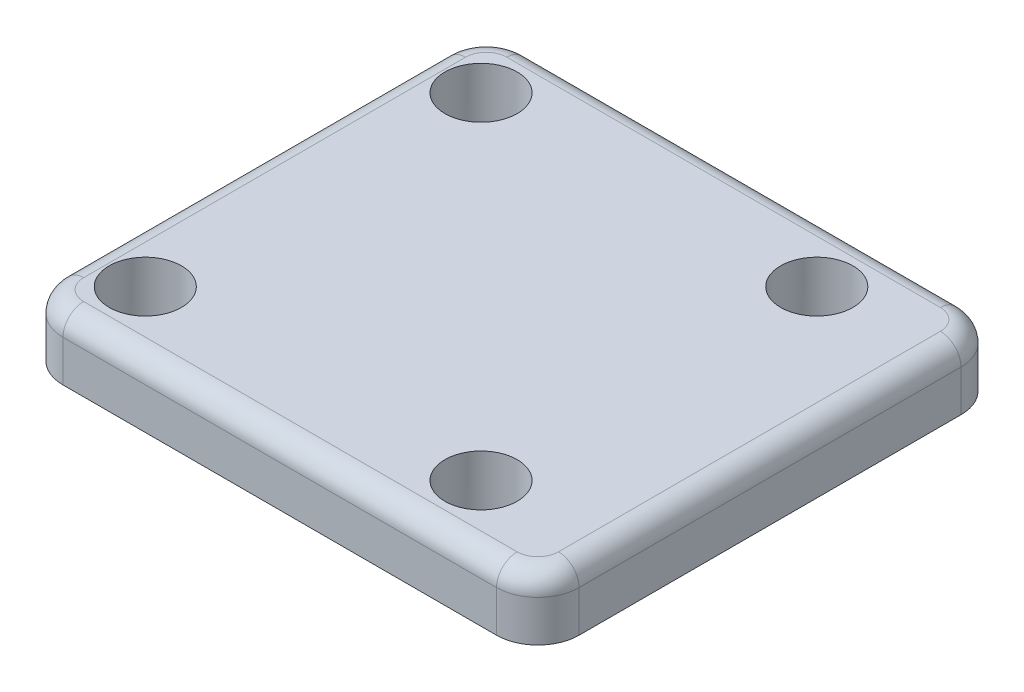
ISO-10303-21;
HEADER;
FILE_DESCRIPTION(('STEP AP214'),'2;1');
FILE_NAME('part.step','',(''),(''),'','','');
FILE_SCHEMA(('AUTOMOTIVE_DESIGN { 1 0 10303 214 1 1 1 1 }'));
ENDSEC;
DATA;
#1=APPLICATION_CONTEXT('core data for automotive mechanical design processes');
#2=APPLICATION_PROTOCOL_DEFINITION('international standard','automotive_design',2000,#1);
#3=PRODUCT_CONTEXT('',#1,'mechanical');
#4=PRODUCT('Part','Part','',(#3));
#5=PRODUCT_RELATED_PRODUCT_CATEGORY('part','',(#4));
#6=PRODUCT_DEFINITION_FORMATION('','',#4);
#7=PRODUCT_DEFINITION_CONTEXT('part definition',#1,'design');
#8=PRODUCT_DEFINITION('design','',#6,#7);
#9=PRODUCT_DEFINITION_SHAPE('','',#8);
#10=(LENGTH_UNIT() NAMED_UNIT(*) SI_UNIT(.MILLI.,.METRE.));
#11=(NAMED_UNIT(*) PLANE_ANGLE_UNIT() SI_UNIT($,.RADIAN.));
#12=(NAMED_UNIT(*) SI_UNIT($,.STERADIAN.) SOLID_ANGLE_UNIT());
#13=UNCERTAINTY_MEASURE_WITH_UNIT(LENGTH_MEASURE(1.E-05),#10,'distance_accuracy_value','');
#14=(GEOMETRIC_REPRESENTATION_CONTEXT(3) GLOBAL_UNCERTAINTY_ASSIGNED_CONTEXT((#13)) GLOBAL_UNIT_ASSIGNED_CONTEXT((#10,
#11,#12)) REPRESENTATION_CONTEXT('',''));
#15=CARTESIAN_POINT('',(0.,0.,0.));
#16=DIRECTION('',(0.,0.,1.));
#17=DIRECTION('',(1.,0.,0.));
#18=AXIS2_PLACEMENT_3D('',#15,#16,#17);
#19=CARTESIAN_POINT('',(24.,6.,-18.5));
#20=DIRECTION('',(0.,-1.,0.));
#21=DIRECTION('',(0.,0.,-1.));
#22=AXIS2_PLACEMENT_3D('',#19,#20,#21);
#23=CYLINDRICAL_SURFACE('',#22,4.);
#24=DIRECTION('',(0.,-1.,0.));
#25=VECTOR('',#24,1.);
#26=CARTESIAN_POINT('',(24.,6.,-22.5));
#27=LINE('',#26,#25);
#28=CARTESIAN_POINT('',(24.,4.,-22.5));
#29=VERTEX_POINT('',#28);
#30=CARTESIAN_POINT('',(24.,0.,-22.5));
#31=VERTEX_POINT('',#30);
#32=EDGE_CURVE('E132',#29,#31,#27,.T.);
#33=ORIENTED_EDGE('',*,*,#32,.F.);
#34=CARTESIAN_POINT('',(24.,4.,-18.5));
#35=DIRECTION('',(0.,-1.,0.));
#36=DIRECTION('',(0.,0.,-1.));
#37=AXIS2_PLACEMENT_3D('',#34,#35,#36);
#38=CIRCLE('',#37,4.);
#39=CARTESIAN_POINT('',(28.,4.,-18.5));
#40=VERTEX_POINT('',#39);
#41=EDGE_CURVE('E214',#29,#40,#38,.T.);
#42=ORIENTED_EDGE('',*,*,#41,.T.);
#43=DIRECTION('',(0.,-1.,0.));
#44=VECTOR('',#43,1.);
#45=CARTESIAN_POINT('',(28.,6.,-18.5));
#46=LINE('',#45,#44);
#47=CARTESIAN_POINT('',(28.,0.,-18.5));
#48=VERTEX_POINT('',#47);
#49=EDGE_CURVE('E156',#40,#48,#46,.T.);
#50=ORIENTED_EDGE('',*,*,#49,.T.);
#51=CARTESIAN_POINT('',(24.,0.,-18.5));
#52=DIRECTION('',(0.,1.,0.));
#53=DIRECTION('',(0.,0.,-1.));
#54=AXIS2_PLACEMENT_3D('',#51,#52,#53);
#55=CIRCLE('',#54,4.);
#56=EDGE_CURVE('E150',#48,#31,#55,.T.);
#57=ORIENTED_EDGE('',*,*,#56,.T.);
#58=EDGE_LOOP('',(#33,#42,#50,#57));
#59=FACE_BOUND('',#58,.T.);
#60=ADVANCED_FACE('F39',(#59),#23,.T.);
#61=CARTESIAN_POINT('',(-18.,6.,-22.5));
#62=DIRECTION('',(0.,0.,1.));
#63=DIRECTION('',(1.,0.,0.));
#64=AXIS2_PLACEMENT_3D('',#61,#62,#63);
#65=PLANE('',#64);
#66=DIRECTION('',(0.,-1.,0.));
#67=VECTOR('',#66,1.);
#68=CARTESIAN_POINT('',(-18.,6.,-22.5));
#69=LINE('',#68,#67);
#70=CARTESIAN_POINT('',(-18.,4.,-22.5));
#71=VERTEX_POINT('',#70);
#72=CARTESIAN_POINT('',(-18.,0.,-22.5));
#73=VERTEX_POINT('',#72);
#74=EDGE_CURVE('E144',#71,#73,#69,.T.);
#75=ORIENTED_EDGE('',*,*,#74,.F.);
#76=DIRECTION('',(-1.,0.,0.));
#77=VECTOR('',#76,1.);
#78=CARTESIAN_POINT('',(-18.,4.,-22.5));
#79=LINE('',#78,#77);
#80=EDGE_CURVE('E139',#71,#29,#79,.F.);
#81=ORIENTED_EDGE('',*,*,#80,.T.);
#82=ORIENTED_EDGE('',*,*,#32,.T.);
#83=DIRECTION('',(-1.,0.,0.));
#84=VECTOR('',#83,1.);
#85=CARTESIAN_POINT('',(-18.,0.,-22.5));
#86=LINE('',#85,#84);
#87=EDGE_CURVE('E136',#31,#73,#86,.T.);
#88=ORIENTED_EDGE('',*,*,#87,.T.);
#89=EDGE_LOOP('',(#75,#81,#82,#88));
#90=FACE_BOUND('',#89,.T.);
#91=ADVANCED_FACE('F135',(#90),#65,.F.);
#92=CARTESIAN_POINT('',(-18.,6.,-18.5));
#93=DIRECTION('',(0.,-1.,0.));
#94=DIRECTION('',(0.,0.,-1.));
#95=AXIS2_PLACEMENT_3D('',#92,#93,#94);
#96=CYLINDRICAL_SURFACE('',#95,4.);
#97=DIRECTION('',(0.,-1.,0.));
#98=VECTOR('',#97,1.);
#99=CARTESIAN_POINT('',(-22.,6.,-18.5));
#100=LINE('',#99,#98);
#101=CARTESIAN_POINT('',(-22.,4.,-18.5));
#102=VERTEX_POINT('',#101);
#103=CARTESIAN_POINT('',(-22.,0.,-18.5));
#104=VERTEX_POINT('',#103);
#105=EDGE_CURVE('E191',#102,#104,#100,.T.);
#106=ORIENTED_EDGE('',*,*,#105,.F.);
#107=CARTESIAN_POINT('',(-18.,4.,-18.5));
#108=DIRECTION('',(0.,-1.,0.));
#109=DIRECTION('',(0.,0.,-1.));
#110=AXIS2_PLACEMENT_3D('',#107,#108,#109);
#111=CIRCLE('',#110,4.);
#112=EDGE_CURVE('E210',#102,#71,#111,.T.);
#113=ORIENTED_EDGE('',*,*,#112,.T.);
#114=ORIENTED_EDGE('',*,*,#74,.T.);
#115=CARTESIAN_POINT('',(-18.,0.,-18.5));
#116=DIRECTION('',(0.,1.,0.));
#117=DIRECTION('',(0.,0.,-1.));
#118=AXIS2_PLACEMENT_3D('',#115,#116,#117);
#119=CIRCLE('',#118,4.);
#120=EDGE_CURVE('E153',#73,#104,#119,.T.);
#121=ORIENTED_EDGE('',*,*,#120,.T.);
#122=EDGE_LOOP('',(#106,#113,#114,#121));
#123=FACE_BOUND('',#122,.T.);
#124=ADVANCED_FACE('F294',(#123),#96,.T.);
#125=CARTESIAN_POINT('',(-22.,6.,-18.5));
#126=DIRECTION('',(1.,0.,0.));
#127=DIRECTION('',(0.,0.,-1.));
#128=AXIS2_PLACEMENT_3D('',#125,#126,#127);
#129=PLANE('',#128);
#130=DIRECTION('',(0.,-1.,0.));
#131=VECTOR('',#130,1.);
#132=CARTESIAN_POINT('',(-22.,6.,18.5));
#133=LINE('',#132,#131);
#134=CARTESIAN_POINT('',(-22.,4.,18.5));
#135=VERTEX_POINT('',#134);
#136=CARTESIAN_POINT('',(-22.,0.,18.5));
#137=VERTEX_POINT('',#136);
#138=EDGE_CURVE('E189',#135,#137,#133,.T.);
#139=ORIENTED_EDGE('',*,*,#138,.F.);
#140=DIRECTION('',(0.,0.,1.));
#141=VECTOR('',#140,1.);
#142=CARTESIAN_POINT('',(-22.,4.,-18.5));
#143=LINE('',#142,#141);
#144=EDGE_CURVE('E222',#135,#102,#143,.F.);
#145=ORIENTED_EDGE('',*,*,#144,.T.);
#146=ORIENTED_EDGE('',*,*,#105,.T.);
#147=DIRECTION('',(0.,0.,1.));
#148=VECTOR('',#147,1.);
#149=CARTESIAN_POINT('',(-22.,0.,-18.5));
#150=LINE('',#149,#148);
#151=EDGE_CURVE('E168',#104,#137,#150,.T.);
#152=ORIENTED_EDGE('',*,*,#151,.T.);
#153=EDGE_LOOP('',(#139,#145,#146,#152));
#154=FACE_BOUND('',#153,.T.);
#155=ADVANCED_FACE('F337',(#154),#129,.F.);
#156=CARTESIAN_POINT('',(-18.,6.,18.5));
#157=DIRECTION('',(0.,-1.,0.));
#158=DIRECTION('',(0.,0.,-1.));
#159=AXIS2_PLACEMENT_3D('',#156,#157,#158);
#160=CYLINDRICAL_SURFACE('',#159,4.);
#161=DIRECTION('',(0.,-1.,0.));
#162=VECTOR('',#161,1.);
#163=CARTESIAN_POINT('',(-18.,6.,22.5));
#164=LINE('',#163,#162);
#165=CARTESIAN_POINT('',(-18.,4.,22.5));
#166=VERTEX_POINT('',#165);
#167=CARTESIAN_POINT('',(-18.,0.,22.5));
#168=VERTEX_POINT('',#167);
#169=EDGE_CURVE('E187',#166,#168,#164,.T.);
#170=ORIENTED_EDGE('',*,*,#169,.F.);
#171=CARTESIAN_POINT('',(-18.,4.,18.5));
#172=DIRECTION('',(0.,-1.,0.));
#173=DIRECTION('',(0.,0.,-1.));
#174=AXIS2_PLACEMENT_3D('',#171,#172,#173);
#175=CIRCLE('',#174,4.);
#176=EDGE_CURVE('E57',#166,#135,#175,.T.);
#177=ORIENTED_EDGE('',*,*,#176,.T.);
#178=ORIENTED_EDGE('',*,*,#138,.T.);
#179=CARTESIAN_POINT('',(-18.,0.,18.5));
#180=DIRECTION('',(0.,1.,0.));
#181=DIRECTION('',(0.,0.,1.));
#182=AXIS2_PLACEMENT_3D('',#179,#180,#181);
#183=CIRCLE('',#182,4.);
#184=EDGE_CURVE('E171',#137,#168,#183,.T.);
#185=ORIENTED_EDGE('',*,*,#184,.T.);
#186=EDGE_LOOP('',(#170,#177,#178,#185));
#187=FACE_BOUND('',#186,.T.);
#188=ADVANCED_FACE('F368',(#187),#160,.T.);
#189=CARTESIAN_POINT('',(-18.,6.,22.5));
#190=DIRECTION('',(0.,0.,-1.));
#191=DIRECTION('',(-1.,0.,0.));
#192=AXIS2_PLACEMENT_3D('',#189,#190,#191);
#193=PLANE('',#192);
#194=DIRECTION('',(0.,-1.,0.));
#195=VECTOR('',#194,1.);
#196=CARTESIAN_POINT('',(24.,6.,22.5));
#197=LINE('',#196,#195);
#198=CARTESIAN_POINT('',(24.,4.,22.5));
#199=VERTEX_POINT('',#198);
#200=CARTESIAN_POINT('',(24.,0.,22.5));
#201=VERTEX_POINT('',#200);
#202=EDGE_CURVE('E185',#199,#201,#197,.T.);
#203=ORIENTED_EDGE('',*,*,#202,.F.);
#204=DIRECTION('',(1.,0.,0.));
#205=VECTOR('',#204,1.);
#206=CARTESIAN_POINT('',(-18.,4.,22.5));
#207=LINE('',#206,#205);
#208=EDGE_CURVE('E65',#199,#166,#207,.F.);
#209=ORIENTED_EDGE('',*,*,#208,.T.);
#210=ORIENTED_EDGE('',*,*,#169,.T.);
#211=DIRECTION('',(1.,0.,0.));
#212=VECTOR('',#211,1.);
#213=CARTESIAN_POINT('',(-18.,0.,22.5));
#214=LINE('',#213,#212);
#215=EDGE_CURVE('E174',#168,#201,#214,.T.);
#216=ORIENTED_EDGE('',*,*,#215,.T.);
#217=EDGE_LOOP('',(#203,#209,#210,#216));
#218=FACE_BOUND('',#217,.T.);
#219=ADVANCED_FACE('F364',(#218),#193,.F.);
#220=CARTESIAN_POINT('',(24.,6.,18.5));
#221=DIRECTION('',(0.,-1.,0.));
#222=DIRECTION('',(0.,0.,-1.));
#223=AXIS2_PLACEMENT_3D('',#220,#221,#222);
#224=CYLINDRICAL_SURFACE('',#223,4.);
#225=DIRECTION('',(0.,-1.,0.));
#226=VECTOR('',#225,1.);
#227=CARTESIAN_POINT('',(28.,6.,18.5));
#228=LINE('',#227,#226);
#229=CARTESIAN_POINT('',(28.,4.,18.5));
#230=VERTEX_POINT('',#229);
#231=CARTESIAN_POINT('',(28.,0.,18.5));
#232=VERTEX_POINT('',#231);
#233=EDGE_CURVE('E183',#230,#232,#228,.T.);
#234=ORIENTED_EDGE('',*,*,#233,.F.);
#235=CARTESIAN_POINT('',(24.,4.,18.5));
#236=DIRECTION('',(0.,-1.,0.));
#237=DIRECTION('',(0.,0.,-1.));
#238=AXIS2_PLACEMENT_3D('',#235,#236,#237);
#239=CIRCLE('',#238,4.);
#240=EDGE_CURVE('E218',#230,#199,#239,.T.);
#241=ORIENTED_EDGE('',*,*,#240,.T.);
#242=ORIENTED_EDGE('',*,*,#202,.T.);
#243=CARTESIAN_POINT('',(24.,0.,18.5));
#244=DIRECTION('',(0.,1.,0.));
#245=DIRECTION('',(0.,0.,1.));
#246=AXIS2_PLACEMENT_3D('',#243,#244,#245);
#247=CIRCLE('',#246,4.);
#248=EDGE_CURVE('E177',#201,#232,#247,.T.);
#249=ORIENTED_EDGE('',*,*,#248,.T.);
#250=EDGE_LOOP('',(#234,#241,#242,#249));
#251=FACE_BOUND('',#250,.T.);
#252=ADVANCED_FACE('F357',(#251),#224,.T.);
#253=CARTESIAN_POINT('',(28.,6.,-18.5));
#254=DIRECTION('',(-1.,0.,0.));
#255=DIRECTION('',(0.,0.,1.));
#256=AXIS2_PLACEMENT_3D('',#253,#254,#255);
#257=PLANE('',#256);
#258=ORIENTED_EDGE('',*,*,#49,.F.);
#259=DIRECTION('',(0.,0.,-1.));
#260=VECTOR('',#259,1.);
#261=CARTESIAN_POINT('',(28.,4.,-18.5));
#262=LINE('',#261,#260);
#263=EDGE_CURVE('E216',#40,#230,#262,.F.);
#264=ORIENTED_EDGE('',*,*,#263,.T.);
#265=ORIENTED_EDGE('',*,*,#233,.T.);
#266=DIRECTION('',(0.,0.,-1.));
#267=VECTOR('',#266,1.);
#268=CARTESIAN_POINT('',(28.,0.,-18.5));
#269=LINE('',#268,#267);
#270=EDGE_CURVE('E180',#232,#48,#269,.T.);
#271=ORIENTED_EDGE('',*,*,#270,.T.);
#272=EDGE_LOOP('',(#258,#264,#265,#271));
#273=FACE_BOUND('',#272,.T.);
#274=ADVANCED_FACE('F348',(#273),#257,.F.);
#275=CARTESIAN_POINT('',(24.,6.,-18.5));
#276=DIRECTION('',(0.,-1.,0.));
#277=DIRECTION('',(0.,0.,-1.));
#278=AXIS2_PLACEMENT_3D('',#275,#276,#277);
#279=PLANE('',#278);
#280=CARTESIAN_POINT('',(-16.2634559672897,6.,16.2634559672906));
#281=DIRECTION('',(0.,1.,0.));
#282=DIRECTION('',(0.,0.,1.));
#283=AXIS2_PLACEMENT_3D('',#280,#281,#282);
#284=CIRCLE('',#283,3.50000000000048);
#285=CARTESIAN_POINT('',(-16.2634559672897,6.,19.7634559672911));
#286=VERTEX_POINT('',#285);
#287=EDGE_CURVE('E585',#286,#286,#284,.T.);
#288=ORIENTED_EDGE('',*,*,#287,.F.);
#289=EDGE_LOOP('',(#288));
#290=FACE_BOUND('',#289,.T.);
#291=CARTESIAN_POINT('',(16.2634559672915,6.,16.2634559672897));
#292=DIRECTION('',(0.,1.,0.));
#293=DIRECTION('',(0.,0.,1.));
#294=AXIS2_PLACEMENT_3D('',#291,#292,#293);
#295=CIRCLE('',#294,3.50000000000127);
#296=CARTESIAN_POINT('',(16.2634559672915,6.,19.763455967291));
#297=VERTEX_POINT('',#296);
#298=EDGE_CURVE('E583',#297,#297,#295,.T.);
#299=ORIENTED_EDGE('',*,*,#298,.F.);
#300=EDGE_LOOP('',(#299));
#301=FACE_BOUND('',#300,.T.);
#302=CARTESIAN_POINT('',(16.2634559672906,6.,-16.2634559672915));
#303=DIRECTION('',(0.,1.,0.));
#304=DIRECTION('',(0.,0.,1.));
#305=AXIS2_PLACEMENT_3D('',#302,#303,#304);
#306=CIRCLE('',#305,3.50000000000094);
#307=CARTESIAN_POINT('',(16.2634559672906,6.,-12.7634559672905));
#308=VERTEX_POINT('',#307);
#309=EDGE_CURVE('E584',#308,#308,#306,.T.);
#310=ORIENTED_EDGE('',*,*,#309,.F.);
#311=EDGE_LOOP('',(#310));
#312=FACE_BOUND('',#311,.T.);
#313=CARTESIAN_POINT('',(-16.2634559672906,6.,-16.2634559672906));
#314=DIRECTION('',(0.,1.,0.));
#315=DIRECTION('',(0.,0.,1.));
#316=AXIS2_PLACEMENT_3D('',#313,#314,#315);
#317=CIRCLE('',#316,3.5);
#318=CARTESIAN_POINT('',(-16.2634559672906,6.,-12.7634559672906));
#319=VERTEX_POINT('',#318);
#320=EDGE_CURVE('E248',#319,#319,#317,.T.);
#321=ORIENTED_EDGE('',*,*,#320,.F.);
#322=EDGE_LOOP('',(#321));
#323=FACE_BOUND('',#322,.T.);
#324=DIRECTION('',(-1.,0.,0.));
#325=VECTOR('',#324,1.);
#326=CARTESIAN_POINT('',(24.,6.,-20.5));
#327=LINE('',#326,#325);
#328=CARTESIAN_POINT('',(24.,6.,-20.5));
#329=VERTEX_POINT('',#328);
#330=CARTESIAN_POINT('',(-18.,6.,-20.5));
#331=VERTEX_POINT('',#330);
#332=EDGE_CURVE('E205',#329,#331,#327,.T.);
#333=ORIENTED_EDGE('',*,*,#332,.T.);
#334=CARTESIAN_POINT('',(-18.,6.,-18.5));
#335=DIRECTION('',(0.,-1.,0.));
#336=DIRECTION('',(0.,0.,-1.));
#337=AXIS2_PLACEMENT_3D('',#334,#335,#336);
#338=CIRCLE('',#337,2.);
#339=CARTESIAN_POINT('',(-20.,6.,-18.5));
#340=VERTEX_POINT('',#339);
#341=EDGE_CURVE('E207',#331,#340,#338,.F.);
#342=ORIENTED_EDGE('',*,*,#341,.T.);
#343=DIRECTION('',(0.,0.,1.));
#344=VECTOR('',#343,1.);
#345=CARTESIAN_POINT('',(-20.,6.,-18.5));
#346=LINE('',#345,#344);
#347=CARTESIAN_POINT('',(-20.,6.,18.5));
#348=VERTEX_POINT('',#347);
#349=EDGE_CURVE('E143',#340,#348,#346,.T.);
#350=ORIENTED_EDGE('',*,*,#349,.T.);
#351=CARTESIAN_POINT('',(-18.,6.,18.5));
#352=DIRECTION('',(0.,-1.,0.));
#353=DIRECTION('',(0.,0.,-1.));
#354=AXIS2_PLACEMENT_3D('',#351,#352,#353);
#355=CIRCLE('',#354,2.);
#356=CARTESIAN_POINT('',(-18.,6.,20.5));
#357=VERTEX_POINT('',#356);
#358=EDGE_CURVE('E195',#348,#357,#355,.F.);
#359=ORIENTED_EDGE('',*,*,#358,.T.);
#360=DIRECTION('',(1.,0.,0.));
#361=VECTOR('',#360,1.);
#362=CARTESIAN_POINT('',(24.,6.,20.5));
#363=LINE('',#362,#361);
#364=CARTESIAN_POINT('',(24.,6.,20.5));
#365=VERTEX_POINT('',#364);
#366=EDGE_CURVE('E197',#357,#365,#363,.T.);
#367=ORIENTED_EDGE('',*,*,#366,.T.);
#368=CARTESIAN_POINT('',(24.,6.,18.5));
#369=DIRECTION('',(0.,-1.,0.));
#370=DIRECTION('',(0.,0.,-1.));
#371=AXIS2_PLACEMENT_3D('',#368,#369,#370);
#372=CIRCLE('',#371,2.);
#373=CARTESIAN_POINT('',(26.,6.,18.5));
#374=VERTEX_POINT('',#373);
#375=EDGE_CURVE('E199',#365,#374,#372,.F.);
#376=ORIENTED_EDGE('',*,*,#375,.T.);
#377=DIRECTION('',(0.,0.,-1.));
#378=VECTOR('',#377,1.);
#379=CARTESIAN_POINT('',(26.,6.,-18.5));
#380=LINE('',#379,#378);
#381=CARTESIAN_POINT('',(26.,6.,-18.5));
#382=VERTEX_POINT('',#381);
#383=EDGE_CURVE('E201',#374,#382,#380,.T.);
#384=ORIENTED_EDGE('',*,*,#383,.T.);
#385=CARTESIAN_POINT('',(24.,6.,-18.5));
#386=DIRECTION('',(0.,-1.,0.));
#387=DIRECTION('',(0.,0.,-1.));
#388=AXIS2_PLACEMENT_3D('',#385,#386,#387);
#389=CIRCLE('',#388,2.);
#390=EDGE_CURVE('E203',#382,#329,#389,.F.);
#391=ORIENTED_EDGE('',*,*,#390,.T.);
#392=EDGE_LOOP('',(#333,#342,#350,#359,#367,#376,#384,#391));
#393=FACE_BOUND('',#392,.T.);
#394=ADVANCED_FACE('F263',(#290,#301,#312,#323,#393),#279,.F.);
#395=CARTESIAN_POINT('',(24.,0.,-18.5));
#396=DIRECTION('',(0.,-1.,0.));
#397=DIRECTION('',(0.,0.,-1.));
#398=AXIS2_PLACEMENT_3D('',#395,#396,#397);
#399=PLANE('',#398);
#400=CARTESIAN_POINT('',(-16.2634559672897,0.,16.2634559672906));
#401=DIRECTION('',(0.,-1.,0.));
#402=DIRECTION('',(0.,0.,-1.));
#403=AXIS2_PLACEMENT_3D('',#400,#401,#402);
#404=CIRCLE('',#403,3.50000000000048);
#405=CARTESIAN_POINT('',(-16.2634559672897,0.,12.7634559672901));
#406=VERTEX_POINT('',#405);
#407=EDGE_CURVE('E44',#406,#406,#404,.T.);
#408=ORIENTED_EDGE('',*,*,#407,.F.);
#409=EDGE_LOOP('',(#408));
#410=FACE_BOUND('',#409,.T.);
#411=CARTESIAN_POINT('',(16.2634559672915,0.,16.2634559672897));
#412=DIRECTION('',(0.,-1.,0.));
#413=DIRECTION('',(0.,0.,-1.));
#414=AXIS2_PLACEMENT_3D('',#411,#412,#413);
#415=CIRCLE('',#414,3.50000000000127);
#416=CARTESIAN_POINT('',(16.2634559672915,0.,12.7634559672884));
#417=VERTEX_POINT('',#416);
#418=EDGE_CURVE('E250',#417,#417,#415,.T.);
#419=ORIENTED_EDGE('',*,*,#418,.F.);
#420=EDGE_LOOP('',(#419));
#421=FACE_BOUND('',#420,.T.);
#422=CARTESIAN_POINT('',(16.2634559672906,0.,-16.2634559672915));
#423=DIRECTION('',(0.,-1.,0.));
#424=DIRECTION('',(0.,0.,-1.));
#425=AXIS2_PLACEMENT_3D('',#422,#423,#424);
#426=CIRCLE('',#425,3.50000000000094);
#427=CARTESIAN_POINT('',(16.2634559672906,0.,-19.7634559672924));
#428=VERTEX_POINT('',#427);
#429=EDGE_CURVE('E247',#428,#428,#426,.T.);
#430=ORIENTED_EDGE('',*,*,#429,.F.);
#431=EDGE_LOOP('',(#430));
#432=FACE_BOUND('',#431,.T.);
#433=CARTESIAN_POINT('',(-16.2634559672906,0.,-16.2634559672906));
#434=DIRECTION('',(0.,-1.,0.));
#435=DIRECTION('',(0.,0.,-1.));
#436=AXIS2_PLACEMENT_3D('',#433,#434,#435);
#437=CIRCLE('',#436,3.5);
#438=CARTESIAN_POINT('',(-16.2634559672906,0.,-19.7634559672906));
#439=VERTEX_POINT('',#438);
#440=EDGE_CURVE('E244',#439,#439,#437,.T.);
#441=ORIENTED_EDGE('',*,*,#440,.F.);
#442=EDGE_LOOP('',(#441));
#443=FACE_BOUND('',#442,.T.);
#444=CARTESIAN_POINT('',(0.,0.,0.));
#445=DIRECTION('',(0.,-1.,0.));
#446=DIRECTION('',(0.,0.,-1.));
#447=AXIS2_PLACEMENT_3D('',#444,#445,#446);
#448=CIRCLE('',#447,16.);
#449=CARTESIAN_POINT('',(0.,0.,-16.));
#450=VERTEX_POINT('',#449);
#451=EDGE_CURVE('E164',#450,#450,#448,.T.);
#452=ORIENTED_EDGE('',*,*,#451,.F.);
#453=EDGE_LOOP('',(#452));
#454=FACE_BOUND('',#453,.T.);
#455=ORIENTED_EDGE('',*,*,#56,.F.);
#456=ORIENTED_EDGE('',*,*,#270,.F.);
#457=ORIENTED_EDGE('',*,*,#248,.F.);
#458=ORIENTED_EDGE('',*,*,#215,.F.);
#459=ORIENTED_EDGE('',*,*,#184,.F.);
#460=ORIENTED_EDGE('',*,*,#151,.F.);
#461=ORIENTED_EDGE('',*,*,#120,.F.);
#462=ORIENTED_EDGE('',*,*,#87,.F.);
#463=EDGE_LOOP('',(#455,#456,#457,#458,#459,#460,#461,#462));
#464=FACE_BOUND('',#463,.T.);
#465=ADVANCED_FACE('F148',(#410,#421,#432,#443,#454,#464),#399,.T.);
#466=CARTESIAN_POINT('',(24.,4.,18.5));
#467=DIRECTION('',(0.,-1.,0.));
#468=DIRECTION('',(0.,0.,-1.));
#469=AXIS2_PLACEMENT_3D('',#466,#467,#468);
#470=DEGENERATE_TOROIDAL_SURFACE('',#469,2.,2.,.T.);
#471=CARTESIAN_POINT('',(24.,4.,20.5));
#472=DIRECTION('',(-1.,0.,0.));
#473=DIRECTION('',(0.,0.,1.));
#474=AXIS2_PLACEMENT_3D('',#471,#472,#473);
#475=CIRCLE('',#474,2.);
#476=EDGE_CURVE('E161',#199,#365,#475,.T.);
#477=ORIENTED_EDGE('',*,*,#476,.F.);
#478=ORIENTED_EDGE('',*,*,#240,.F.);
#479=CARTESIAN_POINT('',(26.,4.,18.5));
#480=DIRECTION('',(0.,0.,-1.));
#481=DIRECTION('',(-1.,0.,0.));
#482=AXIS2_PLACEMENT_3D('',#479,#480,#481);
#483=CIRCLE('',#482,2.);
#484=EDGE_CURVE('E158',#374,#230,#483,.T.);
#485=ORIENTED_EDGE('',*,*,#484,.F.);
#486=ORIENTED_EDGE('',*,*,#375,.F.);
#487=EDGE_LOOP('',(#477,#478,#485,#486));
#488=FACE_BOUND('',#487,.T.);
#489=ADVANCED_FACE('F262',(#488),#470,.T.);
#490=CARTESIAN_POINT('',(26.,4.,-18.5));
#491=DIRECTION('',(0.,0.,-1.));
#492=DIRECTION('',(-1.,0.,0.));
#493=AXIS2_PLACEMENT_3D('',#490,#491,#492);
#494=CYLINDRICAL_SURFACE('',#493,2.);
#495=ORIENTED_EDGE('',*,*,#484,.T.);
#496=ORIENTED_EDGE('',*,*,#263,.F.);
#497=CARTESIAN_POINT('',(26.,4.,-18.5));
#498=DIRECTION('',(0.,0.,-1.));
#499=DIRECTION('',(-1.,0.,0.));
#500=AXIS2_PLACEMENT_3D('',#497,#498,#499);
#501=CIRCLE('',#500,2.);
#502=EDGE_CURVE('E237',#382,#40,#501,.T.);
#503=ORIENTED_EDGE('',*,*,#502,.F.);
#504=ORIENTED_EDGE('',*,*,#383,.F.);
#505=EDGE_LOOP('',(#495,#496,#503,#504));
#506=FACE_BOUND('',#505,.T.);
#507=ADVANCED_FACE('F316',(#506),#494,.T.);
#508=CARTESIAN_POINT('',(24.,4.,20.5));
#509=DIRECTION('',(1.,0.,0.));
#510=DIRECTION('',(0.,0.,-1.));
#511=AXIS2_PLACEMENT_3D('',#508,#509,#510);
#512=CYLINDRICAL_SURFACE('',#511,2.);
#513=ORIENTED_EDGE('',*,*,#476,.T.);
#514=ORIENTED_EDGE('',*,*,#366,.F.);
#515=CARTESIAN_POINT('',(-18.,4.,20.5));
#516=DIRECTION('',(-1.,0.,0.));
#517=DIRECTION('',(0.,0.,1.));
#518=AXIS2_PLACEMENT_3D('',#515,#516,#517);
#519=CIRCLE('',#518,2.);
#520=EDGE_CURVE('E234',#166,#357,#519,.T.);
#521=ORIENTED_EDGE('',*,*,#520,.F.);
#522=ORIENTED_EDGE('',*,*,#208,.F.);
#523=EDGE_LOOP('',(#513,#514,#521,#522));
#524=FACE_BOUND('',#523,.T.);
#525=ADVANCED_FACE('F312',(#524),#512,.T.);
#526=CARTESIAN_POINT('',(24.,4.,-18.5));
#527=DIRECTION('',(0.,-1.,0.));
#528=DIRECTION('',(0.,0.,-1.));
#529=AXIS2_PLACEMENT_3D('',#526,#527,#528);
#530=DEGENERATE_TOROIDAL_SURFACE('',#529,2.,2.,.T.);
#531=ORIENTED_EDGE('',*,*,#502,.T.);
#532=ORIENTED_EDGE('',*,*,#41,.F.);
#533=CARTESIAN_POINT('',(24.,4.,-20.5));
#534=DIRECTION('',(-1.,0.,0.));
#535=DIRECTION('',(0.,0.,1.));
#536=AXIS2_PLACEMENT_3D('',#533,#534,#535);
#537=CIRCLE('',#536,2.);
#538=EDGE_CURVE('E231',#329,#29,#537,.T.);
#539=ORIENTED_EDGE('',*,*,#538,.F.);
#540=ORIENTED_EDGE('',*,*,#390,.F.);
#541=EDGE_LOOP('',(#531,#532,#539,#540));
#542=FACE_BOUND('',#541,.T.);
#543=ADVANCED_FACE('F308',(#542),#530,.T.);
#544=CARTESIAN_POINT('',(-18.,4.,18.5));
#545=DIRECTION('',(0.,-1.,0.));
#546=DIRECTION('',(0.,0.,-1.));
#547=AXIS2_PLACEMENT_3D('',#544,#545,#546);
#548=DEGENERATE_TOROIDAL_SURFACE('',#547,2.,2.,.T.);
#549=ORIENTED_EDGE('',*,*,#520,.T.);
#550=ORIENTED_EDGE('',*,*,#358,.F.);
#551=CARTESIAN_POINT('',(-20.,4.,18.5));
#552=DIRECTION('',(0.,0.,-1.));
#553=DIRECTION('',(-1.,0.,0.));
#554=AXIS2_PLACEMENT_3D('',#551,#552,#553);
#555=CIRCLE('',#554,2.);
#556=EDGE_CURVE('E228',#135,#348,#555,.T.);
#557=ORIENTED_EDGE('',*,*,#556,.F.);
#558=ORIENTED_EDGE('',*,*,#176,.F.);
#559=EDGE_LOOP('',(#549,#550,#557,#558));
#560=FACE_BOUND('',#559,.T.);
#561=ADVANCED_FACE('F304',(#560),#548,.T.);
#562=CARTESIAN_POINT('',(24.,4.,-20.5));
#563=DIRECTION('',(-1.,0.,0.));
#564=DIRECTION('',(0.,0.,1.));
#565=AXIS2_PLACEMENT_3D('',#562,#563,#564);
#566=CYLINDRICAL_SURFACE('',#565,2.);
#567=ORIENTED_EDGE('',*,*,#538,.T.);
#568=ORIENTED_EDGE('',*,*,#80,.F.);
#569=CARTESIAN_POINT('',(-18.,4.,-20.5));
#570=DIRECTION('',(-1.,0.,0.));
#571=DIRECTION('',(0.,0.,1.));
#572=AXIS2_PLACEMENT_3D('',#569,#570,#571);
#573=CIRCLE('',#572,2.);
#574=EDGE_CURVE('E226',#331,#71,#573,.T.);
#575=ORIENTED_EDGE('',*,*,#574,.F.);
#576=ORIENTED_EDGE('',*,*,#332,.F.);
#577=EDGE_LOOP('',(#567,#568,#575,#576));
#578=FACE_BOUND('',#577,.T.);
#579=ADVANCED_FACE('F300',(#578),#566,.T.);
#580=CARTESIAN_POINT('',(-20.,4.,-18.5));
#581=DIRECTION('',(0.,0.,1.));
#582=DIRECTION('',(1.,0.,0.));
#583=AXIS2_PLACEMENT_3D('',#580,#581,#582);
#584=CYLINDRICAL_SURFACE('',#583,2.);
#585=ORIENTED_EDGE('',*,*,#556,.T.);
#586=ORIENTED_EDGE('',*,*,#349,.F.);
#587=CARTESIAN_POINT('',(-20.,4.,-18.5));
#588=DIRECTION('',(0.,0.,-1.));
#589=DIRECTION('',(0.,1.,0.));
#590=AXIS2_PLACEMENT_3D('',#587,#588,#589);
#591=CIRCLE('',#590,2.);
#592=EDGE_CURVE('E224',#102,#340,#591,.T.);
#593=ORIENTED_EDGE('',*,*,#592,.F.);
#594=ORIENTED_EDGE('',*,*,#144,.F.);
#595=EDGE_LOOP('',(#585,#586,#593,#594));
#596=FACE_BOUND('',#595,.T.);
#597=ADVANCED_FACE('F285',(#596),#584,.T.);
#598=CARTESIAN_POINT('',(-18.,4.,-18.5));
#599=DIRECTION('',(0.,-1.,0.));
#600=DIRECTION('',(0.,0.,-1.));
#601=AXIS2_PLACEMENT_3D('',#598,#599,#600);
#602=DEGENERATE_TOROIDAL_SURFACE('',#601,2.,2.,.T.);
#603=ORIENTED_EDGE('',*,*,#574,.T.);
#604=ORIENTED_EDGE('',*,*,#112,.F.);
#605=ORIENTED_EDGE('',*,*,#592,.T.);
#606=ORIENTED_EDGE('',*,*,#341,.F.);
#607=EDGE_LOOP('',(#603,#604,#605,#606));
#608=FACE_BOUND('',#607,.T.);
#609=ADVANCED_FACE('F276',(#608),#602,.T.);
#610=CARTESIAN_POINT('',(0.,-2.,0.));
#611=DIRECTION('',(0.,1.,0.));
#612=DIRECTION('',(0.,0.,1.));
#613=AXIS2_PLACEMENT_3D('',#610,#611,#612);
#614=CYLINDRICAL_SURFACE('',#613,16.);
#615=CARTESIAN_POINT('',(0.,-0.999999999999999,0.));
#616=DIRECTION('',(0.,-1.,0.));
#617=DIRECTION('',(0.,0.,-1.));
#618=AXIS2_PLACEMENT_3D('',#615,#616,#617);
#619=CIRCLE('',#618,16.);
#620=CARTESIAN_POINT('',(0.,-0.999999999999999,-16.));
#621=VERTEX_POINT('',#620);
#622=EDGE_CURVE('E11',#621,#621,#619,.F.);
#623=ORIENTED_EDGE('',*,*,#622,.T.);
#624=EDGE_LOOP('',(#623));
#625=FACE_BOUND('',#624,.T.);
#626=ORIENTED_EDGE('',*,*,#451,.T.);
#627=EDGE_LOOP('',(#626));
#628=FACE_BOUND('',#627,.T.);
#629=ADVANCED_FACE('F273',(#625,#628),#614,.T.);
#630=CARTESIAN_POINT('',(0.,-2.,0.));
#631=DIRECTION('',(0.,-1.,0.));
#632=DIRECTION('',(0.,0.,-1.));
#633=AXIS2_PLACEMENT_3D('',#630,#631,#632);
#634=PLANE('',#633);
#635=CARTESIAN_POINT('',(0.,-2.,0.));
#636=DIRECTION('',(0.,-1.,0.));
#637=DIRECTION('',(0.,0.,-1.));
#638=AXIS2_PLACEMENT_3D('',#635,#636,#637);
#639=CIRCLE('',#638,15.);
#640=CARTESIAN_POINT('',(0.,-2.,-15.));
#641=VERTEX_POINT('',#640);
#642=EDGE_CURVE('E49',#641,#641,#639,.T.);
#643=ORIENTED_EDGE('',*,*,#642,.T.);
#644=EDGE_LOOP('',(#643));
#645=FACE_BOUND('',#644,.T.);
#646=ADVANCED_FACE('F275',(#645),#634,.T.);
#647=CARTESIAN_POINT('',(0.,-2.,0.));
#648=DIRECTION('',(0.,1.,0.));
#649=DIRECTION('',(0.,0.,1.));
#650=AXIS2_PLACEMENT_3D('',#647,#648,#649);
#651=CONICAL_SURFACE('',#650,15.,0.785398163397448);
#652=ORIENTED_EDGE('',*,*,#622,.F.);
#653=EDGE_LOOP('',(#652));
#654=FACE_BOUND('',#653,.T.);
#655=ORIENTED_EDGE('',*,*,#642,.F.);
#656=EDGE_LOOP('',(#655));
#657=FACE_BOUND('',#656,.T.);
#658=ADVANCED_FACE('F42',(#654,#657),#651,.T.);
#659=CARTESIAN_POINT('',(-16.2634559672906,-2.,-16.2634559672906));
#660=DIRECTION('',(0.,1.,0.));
#661=DIRECTION('',(0.,0.,1.));
#662=AXIS2_PLACEMENT_3D('',#659,#660,#661);
#663=CYLINDRICAL_SURFACE('',#662,3.5);
#664=ORIENTED_EDGE('',*,*,#440,.T.);
#665=EDGE_LOOP('',(#664));
#666=FACE_BOUND('',#665,.T.);
#667=ORIENTED_EDGE('',*,*,#320,.T.);
#668=EDGE_LOOP('',(#667));
#669=FACE_BOUND('',#668,.T.);
#670=ADVANCED_FACE('F474',(#666,#669),#663,.F.);
#671=CARTESIAN_POINT('',(16.2634559672906,-2.,-16.2634559672915));
#672=DIRECTION('',(0.,1.,0.));
#673=DIRECTION('',(0.,0.,1.));
#674=AXIS2_PLACEMENT_3D('',#671,#672,#673);
#675=CYLINDRICAL_SURFACE('',#674,3.50000000000094);
#676=ORIENTED_EDGE('',*,*,#429,.T.);
#677=EDGE_LOOP('',(#676));
#678=FACE_BOUND('',#677,.T.);
#679=ORIENTED_EDGE('',*,*,#309,.T.);
#680=EDGE_LOOP('',(#679));
#681=FACE_BOUND('',#680,.T.);
#682=ADVANCED_FACE('F495',(#678,#681),#675,.F.);
#683=CARTESIAN_POINT('',(16.2634559672915,-2.,16.2634559672897));
#684=DIRECTION('',(0.,1.,0.));
#685=DIRECTION('',(0.,0.,1.));
#686=AXIS2_PLACEMENT_3D('',#683,#684,#685);
#687=CYLINDRICAL_SURFACE('',#686,3.50000000000127);
#688=ORIENTED_EDGE('',*,*,#418,.T.);
#689=EDGE_LOOP('',(#688));
#690=FACE_BOUND('',#689,.T.);
#691=ORIENTED_EDGE('',*,*,#298,.T.);
#692=EDGE_LOOP('',(#691));
#693=FACE_BOUND('',#692,.T.);
#694=ADVANCED_FACE('F506',(#690,#693),#687,.F.);
#695=CARTESIAN_POINT('',(-16.2634559672897,-2.,16.2634559672906));
#696=DIRECTION('',(0.,1.,0.));
#697=DIRECTION('',(0.,0.,1.));
#698=AXIS2_PLACEMENT_3D('',#695,#696,#697);
#699=CYLINDRICAL_SURFACE('',#698,3.50000000000048);
#700=ORIENTED_EDGE('',*,*,#407,.T.);
#701=EDGE_LOOP('',(#700));
#702=FACE_BOUND('',#701,.T.);
#703=ORIENTED_EDGE('',*,*,#287,.T.);
#704=EDGE_LOOP('',(#703));
#705=FACE_BOUND('',#704,.T.);
#706=ADVANCED_FACE('F257',(#702,#705),#699,.F.);
#707=CLOSED_SHELL('',(#60,#91,#124,#155,#188,#219,#252,#274,#394,#465,#489,#507,#525,#543,#561,
#579,#597,#609,#629,#646,#658,#670,#682,#694,#706));
#708=MANIFOLD_SOLID_BREP('B2',#707);
#709=ADVANCED_BREP_SHAPE_REPRESENTATION('',(#18,#708),#14);
#710=SHAPE_DEFINITION_REPRESENTATION(#9,#709);
ENDSEC;
END-ISO-10303-21;
